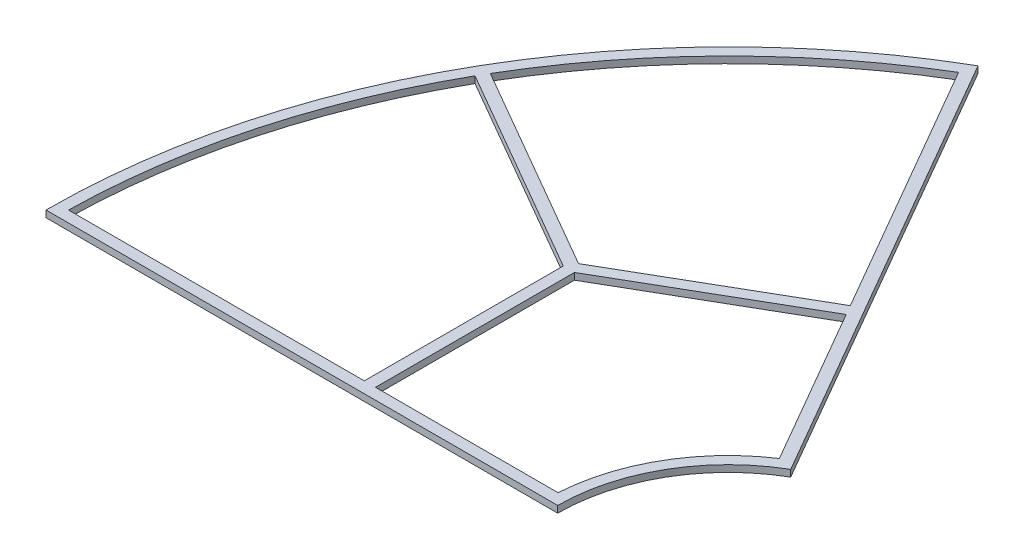
ISO-10303-21;
HEADER;
FILE_DESCRIPTION(('STEP AP214'),'2;1');
FILE_NAME('part.step','',(''),(''),'','','');
FILE_SCHEMA(('AUTOMOTIVE_DESIGN { 1 0 10303 214 1 1 1 1 }'));
ENDSEC;
DATA;
#1=APPLICATION_CONTEXT('core data for automotive mechanical design processes');
#2=APPLICATION_PROTOCOL_DEFINITION('international standard','automotive_design',2000,#1);
#3=PRODUCT_CONTEXT('',#1,'mechanical');
#4=PRODUCT('Part','Part','',(#3));
#5=PRODUCT_RELATED_PRODUCT_CATEGORY('part','',(#4));
#6=PRODUCT_DEFINITION_FORMATION('','',#4);
#7=PRODUCT_DEFINITION_CONTEXT('part definition',#1,'design');
#8=PRODUCT_DEFINITION('design','',#6,#7);
#9=PRODUCT_DEFINITION_SHAPE('','',#8);
#10=(LENGTH_UNIT() NAMED_UNIT(*) SI_UNIT(.MILLI.,.METRE.));
#11=(NAMED_UNIT(*) PLANE_ANGLE_UNIT() SI_UNIT($,.RADIAN.));
#12=(NAMED_UNIT(*) SI_UNIT($,.STERADIAN.) SOLID_ANGLE_UNIT());
#13=UNCERTAINTY_MEASURE_WITH_UNIT(LENGTH_MEASURE(1.E-05),#10,'distance_accuracy_value','');
#14=(GEOMETRIC_REPRESENTATION_CONTEXT(3) GLOBAL_UNCERTAINTY_ASSIGNED_CONTEXT((#13)) GLOBAL_UNIT_ASSIGNED_CONTEXT((#10,
#11,#12)) REPRESENTATION_CONTEXT('',''));
#15=CARTESIAN_POINT('',(0.,0.,0.));
#16=DIRECTION('',(0.,0.,1.));
#17=DIRECTION('',(1.,0.,0.));
#18=AXIS2_PLACEMENT_3D('',#15,#16,#17);
#19=CARTESIAN_POINT('',(2.49999999999996,6.,-4.33012701892212));
#20=DIRECTION('',(-0.5,0.,0.866025403784438));
#21=DIRECTION('',(0.866025403784439,0.,0.5));
#22=AXIS2_PLACEMENT_3D('',#19,#20,#21);
#23=PLANE('',#22);
#24=DIRECTION('',(-0.866025403784439,0.,-0.5));
#25=VECTOR('',#24,1.);
#26=CARTESIAN_POINT('',(2.49999999999996,0.,-4.33012701892212));
#27=LINE('',#26,#25);
#28=CARTESIAN_POINT('',(-330.200000000001,0.,-196.414561578311));
#29=VERTEX_POINT('',#28);
#30=CARTESIAN_POINT('',(-516.750777563212,0.,-304.119703221965));
#31=VERTEX_POINT('',#30);
#32=EDGE_CURVE('E233',#29,#31,#27,.T.);
#33=ORIENTED_EDGE('',*,*,#32,.T.);
#34=DIRECTION('',(0.,-1.,0.));
#35=VECTOR('',#34,1.);
#36=CARTESIAN_POINT('',(-516.750777563212,6.,-304.119703221965));
#37=LINE('',#36,#35);
#38=CARTESIAN_POINT('',(-516.750777563212,6.,-304.119703221965));
#39=VERTEX_POINT('',#38);
#40=EDGE_CURVE('E11',#39,#31,#37,.T.);
#41=ORIENTED_EDGE('',*,*,#40,.F.);
#42=DIRECTION('',(-0.866025403784439,0.,-0.5));
#43=VECTOR('',#42,1.);
#44=CARTESIAN_POINT('',(2.49999999999996,6.,-4.33012701892212));
#45=LINE('',#44,#43);
#46=CARTESIAN_POINT('',(-330.200000000001,6.,-196.414561578311));
#47=VERTEX_POINT('',#46);
#48=EDGE_CURVE('E177',#47,#39,#45,.T.);
#49=ORIENTED_EDGE('',*,*,#48,.F.);
#50=DIRECTION('',(0.,-1.,0.));
#51=VECTOR('',#50,1.);
#52=CARTESIAN_POINT('',(-330.200000000001,6.,-196.414561578311));
#53=LINE('',#52,#51);
#54=EDGE_CURVE('E63',#47,#29,#53,.T.);
#55=ORIENTED_EDGE('',*,*,#54,.T.);
#56=EDGE_LOOP('',(#33,#41,#49,#55));
#57=FACE_BOUND('',#56,.T.);
#58=ADVANCED_FACE('F44',(#57),#23,.F.);
#59=CARTESIAN_POINT('',(1.11022302462516E-13,6.,0.));
#60=DIRECTION('',(0.,-1.,0.));
#61=DIRECTION('',(0.,0.,-1.));
#62=AXIS2_PLACEMENT_3D('',#59,#60,#61);
#63=CYLINDRICAL_SURFACE('',#62,599.6);
#64=CARTESIAN_POINT('',(1.11022302462516E-13,0.,0.));
#65=DIRECTION('',(0.,1.,0.));
#66=DIRECTION('',(0.,0.,1.));
#67=AXIS2_PLACEMENT_3D('',#64,#65,#66);
#68=CIRCLE('',#67,599.6);
#69=CARTESIAN_POINT('',(-308.418556675151,0.,-514.196610158426));
#70=VERTEX_POINT('',#69);
#71=EDGE_CURVE('E183',#31,#70,#68,.F.);
#72=ORIENTED_EDGE('',*,*,#71,.T.);
#73=DIRECTION('',(0.,-1.,0.));
#74=VECTOR('',#73,1.);
#75=CARTESIAN_POINT('',(-308.418556675151,6.,-514.196610158426));
#76=LINE('',#75,#74);
#77=CARTESIAN_POINT('',(-308.418556675151,6.,-514.196610158426));
#78=VERTEX_POINT('',#77);
#79=EDGE_CURVE('E54',#78,#70,#76,.T.);
#80=ORIENTED_EDGE('',*,*,#79,.F.);
#81=CARTESIAN_POINT('',(1.11022302462516E-13,6.,0.));
#82=DIRECTION('',(0.,1.,0.));
#83=DIRECTION('',(0.,0.,1.));
#84=AXIS2_PLACEMENT_3D('',#81,#82,#83);
#85=CIRCLE('',#84,599.6);
#86=EDGE_CURVE('E171',#39,#78,#85,.F.);
#87=ORIENTED_EDGE('',*,*,#86,.F.);
#88=ORIENTED_EDGE('',*,*,#40,.T.);
#89=EDGE_LOOP('',(#72,#80,#87,#88));
#90=FACE_BOUND('',#89,.T.);
#91=ADVANCED_FACE('F182',(#90),#63,.F.);
#92=CARTESIAN_POINT('',(-8.6602540378462,6.,5.00000000000098));
#93=DIRECTION('',(-0.866025403784442,0.,0.499999999999995));
#94=DIRECTION('',(0.499999999999995,0.,0.866025403784442));
#95=AXIS2_PLACEMENT_3D('',#92,#93,#94);
#96=PLANE('',#95);
#97=DIRECTION('',(-0.499999999999995,0.,-0.866025403784442));
#98=VECTOR('',#97,1.);
#99=CARTESIAN_POINT('',(-8.6602540378462,0.,5.00000000000098));
#100=LINE('',#99,#98);
#101=CARTESIAN_POINT('',(-176.260254037845,0.,-285.291715348544));
#102=VERTEX_POINT('',#101);
#103=EDGE_CURVE('E236',#102,#70,#100,.T.);
#104=ORIENTED_EDGE('',*,*,#103,.F.);
#105=DIRECTION('',(0.,-1.,0.));
#106=VECTOR('',#105,1.);
#107=CARTESIAN_POINT('',(-176.260254037845,6.,-285.291715348544));
#108=LINE('',#107,#106);
#109=CARTESIAN_POINT('',(-176.260254037845,6.,-285.291715348544));
#110=VERTEX_POINT('',#109);
#111=EDGE_CURVE('E116',#110,#102,#108,.T.);
#112=ORIENTED_EDGE('',*,*,#111,.F.);
#113=DIRECTION('',(-0.499999999999995,0.,-0.866025403784442));
#114=VECTOR('',#113,1.);
#115=CARTESIAN_POINT('',(-8.6602540378462,6.,5.00000000000098));
#116=LINE('',#115,#114);
#117=EDGE_CURVE('E176',#110,#78,#116,.T.);
#118=ORIENTED_EDGE('',*,*,#117,.T.);
#119=ORIENTED_EDGE('',*,*,#79,.T.);
#120=EDGE_LOOP('',(#104,#112,#118,#119));
#121=FACE_BOUND('',#120,.T.);
#122=ADVANCED_FACE('F187',(#121),#96,.T.);
#123=CARTESIAN_POINT('',(-8.66025403784625,6.,5.000000000001));
#124=DIRECTION('',(-0.866025403784442,0.,0.499999999999994));
#125=DIRECTION('',(0.499999999999994,0.,0.866025403784442));
#126=AXIS2_PLACEMENT_3D('',#123,#124,#125);
#127=PLANE('',#126);
#128=DIRECTION('',(-0.499999999999994,0.,-0.866025403784442));
#129=VECTOR('',#128,1.);
#130=CARTESIAN_POINT('',(-8.66025403784625,0.,5.000000000001));
#131=LINE('',#130,#129);
#132=CARTESIAN_POINT('',(-89.7061669514525,0.,-135.37563891217));
#133=VERTEX_POINT('',#132);
#134=CARTESIAN_POINT('',(-171.260254037845,0.,-276.6314613107));
#135=VERTEX_POINT('',#134);
#136=EDGE_CURVE('E218',#133,#135,#131,.T.);
#137=ORIENTED_EDGE('',*,*,#136,.F.);
#138=DIRECTION('',(0.,-1.,0.));
#139=VECTOR('',#138,1.);
#140=CARTESIAN_POINT('',(-89.7061669514525,6.,-135.37563891217));
#141=LINE('',#140,#139);
#142=CARTESIAN_POINT('',(-89.7061669514525,6.,-135.37563891217));
#143=VERTEX_POINT('',#142);
#144=EDGE_CURVE('E243',#143,#133,#141,.T.);
#145=ORIENTED_EDGE('',*,*,#144,.F.);
#146=DIRECTION('',(-0.499999999999994,0.,-0.866025403784442));
#147=VECTOR('',#146,1.);
#148=CARTESIAN_POINT('',(-8.66025403784625,6.,5.000000000001));
#149=LINE('',#148,#147);
#150=CARTESIAN_POINT('',(-171.260254037845,6.,-276.6314613107));
#151=VERTEX_POINT('',#150);
#152=EDGE_CURVE('E548',#143,#151,#149,.T.);
#153=ORIENTED_EDGE('',*,*,#152,.T.);
#154=DIRECTION('',(0.,-1.,0.));
#155=VECTOR('',#154,1.);
#156=CARTESIAN_POINT('',(-171.260254037845,6.,-276.6314613107));
#157=LINE('',#156,#155);
#158=EDGE_CURVE('E245',#151,#135,#157,.T.);
#159=ORIENTED_EDGE('',*,*,#158,.T.);
#160=EDGE_LOOP('',(#137,#145,#153,#159));
#161=FACE_BOUND('',#160,.T.);
#162=ADVANCED_FACE('F320',(#161),#127,.T.);
#163=CARTESIAN_POINT('',(0.,6.,0.));
#164=DIRECTION('',(0.,-1.,0.));
#165=DIRECTION('',(0.,0.,-1.));
#166=AXIS2_PLACEMENT_3D('',#163,#164,#165);
#167=CYLINDRICAL_SURFACE('',#166,162.4);
#168=CARTESIAN_POINT('',(0.,0.,0.));
#169=DIRECTION('',(0.,1.,0.));
#170=DIRECTION('',(0.,0.,1.));
#171=AXIS2_PLACEMENT_3D('',#168,#169,#170);
#172=CIRCLE('',#171,162.4);
#173=CARTESIAN_POINT('',(-162.091825827214,0.,-10.));
#174=VERTEX_POINT('',#173);
#175=EDGE_CURVE('E221',#133,#174,#172,.T.);
#176=ORIENTED_EDGE('',*,*,#175,.T.);
#177=DIRECTION('',(0.,-1.,0.));
#178=VECTOR('',#177,1.);
#179=CARTESIAN_POINT('',(-162.091825827214,6.,-10.));
#180=LINE('',#179,#178);
#181=CARTESIAN_POINT('',(-162.091825827214,6.,-10.));
#182=VERTEX_POINT('',#181);
#183=EDGE_CURVE('E254',#182,#174,#180,.T.);
#184=ORIENTED_EDGE('',*,*,#183,.F.);
#185=CARTESIAN_POINT('',(0.,6.,0.));
#186=DIRECTION('',(0.,1.,0.));
#187=DIRECTION('',(0.,0.,1.));
#188=AXIS2_PLACEMENT_3D('',#185,#186,#187);
#189=CIRCLE('',#188,162.4);
#190=EDGE_CURVE('E545',#143,#182,#189,.T.);
#191=ORIENTED_EDGE('',*,*,#190,.F.);
#192=ORIENTED_EDGE('',*,*,#144,.T.);
#193=EDGE_LOOP('',(#176,#184,#191,#192));
#194=FACE_BOUND('',#193,.T.);
#195=ADVANCED_FACE('F316',(#194),#167,.T.);
#196=CARTESIAN_POINT('',(0.,6.,-10.));
#197=DIRECTION('',(0.,0.,1.));
#198=DIRECTION('',(1.,0.,0.));
#199=AXIS2_PLACEMENT_3D('',#196,#197,#198);
#200=PLANE('',#199);
#201=DIRECTION('',(-1.,0.,0.));
#202=VECTOR('',#201,1.);
#203=CARTESIAN_POINT('',(0.,0.,-10.));
#204=LINE('',#203,#202);
#205=CARTESIAN_POINT('',(-325.2,0.,-10.));
#206=VERTEX_POINT('',#205);
#207=EDGE_CURVE('E224',#174,#206,#204,.T.);
#208=ORIENTED_EDGE('',*,*,#207,.T.);
#209=DIRECTION('',(0.,-1.,0.));
#210=VECTOR('',#209,1.);
#211=CARTESIAN_POINT('',(-325.2,6.,-10.));
#212=LINE('',#211,#210);
#213=CARTESIAN_POINT('',(-325.2,6.,-10.));
#214=VERTEX_POINT('',#213);
#215=EDGE_CURVE('E251',#214,#206,#212,.T.);
#216=ORIENTED_EDGE('',*,*,#215,.F.);
#217=DIRECTION('',(-1.,0.,0.));
#218=VECTOR('',#217,1.);
#219=CARTESIAN_POINT('',(0.,6.,-10.));
#220=LINE('',#219,#218);
#221=EDGE_CURVE('E542',#182,#214,#220,.T.);
#222=ORIENTED_EDGE('',*,*,#221,.F.);
#223=ORIENTED_EDGE('',*,*,#183,.T.);
#224=EDGE_LOOP('',(#208,#216,#222,#223));
#225=FACE_BOUND('',#224,.T.);
#226=ADVANCED_FACE('F312',(#225),#200,.F.);
#227=CARTESIAN_POINT('',(-325.2,6.,0.));
#228=DIRECTION('',(-1.,0.,0.));
#229=DIRECTION('',(0.,0.,1.));
#230=AXIS2_PLACEMENT_3D('',#227,#228,#229);
#231=PLANE('',#230);
#232=DIRECTION('',(0.,0.,-1.));
#233=VECTOR('',#232,1.);
#234=CARTESIAN_POINT('',(-325.2,0.,0.));
#235=LINE('',#234,#233);
#236=CARTESIAN_POINT('',(-325.2,0.,-187.754307540467));
#237=VERTEX_POINT('',#236);
#238=EDGE_CURVE('E227',#206,#237,#235,.T.);
#239=ORIENTED_EDGE('',*,*,#238,.T.);
#240=DIRECTION('',(0.,-1.,0.));
#241=VECTOR('',#240,1.);
#242=CARTESIAN_POINT('',(-325.2,6.,-187.754307540467));
#243=LINE('',#242,#241);
#244=CARTESIAN_POINT('',(-325.2,6.,-187.754307540467));
#245=VERTEX_POINT('',#244);
#246=EDGE_CURVE('E247',#245,#237,#243,.T.);
#247=ORIENTED_EDGE('',*,*,#246,.F.);
#248=DIRECTION('',(0.,0.,-1.));
#249=VECTOR('',#248,1.);
#250=CARTESIAN_POINT('',(-325.2,6.,0.));
#251=LINE('',#250,#249);
#252=EDGE_CURVE('E537',#214,#245,#251,.T.);
#253=ORIENTED_EDGE('',*,*,#252,.F.);
#254=ORIENTED_EDGE('',*,*,#215,.T.);
#255=EDGE_LOOP('',(#239,#247,#253,#254));
#256=FACE_BOUND('',#255,.T.);
#257=ADVANCED_FACE('F308',(#256),#231,.F.);
#258=CARTESIAN_POINT('',(0.,6.,-10.));
#259=DIRECTION('',(0.,0.,1.));
#260=DIRECTION('',(1.,0.,0.));
#261=AXIS2_PLACEMENT_3D('',#258,#259,#260);
#262=PLANE('',#261);
#263=DIRECTION('',(-1.,0.,0.));
#264=VECTOR('',#263,1.);
#265=CARTESIAN_POINT('',(0.,0.,-10.));
#266=LINE('',#265,#264);
#267=CARTESIAN_POINT('',(-335.2,0.,-10.));
#268=VERTEX_POINT('',#267);
#269=CARTESIAN_POINT('',(-599.516605274616,0.,-10.));
#270=VERTEX_POINT('',#269);
#271=EDGE_CURVE('E206',#268,#270,#266,.T.);
#272=ORIENTED_EDGE('',*,*,#271,.T.);
#273=DIRECTION('',(0.,-1.,0.));
#274=VECTOR('',#273,1.);
#275=CARTESIAN_POINT('',(-599.516605274616,6.,-10.));
#276=LINE('',#275,#274);
#277=CARTESIAN_POINT('',(-599.516605274616,6.,-10.));
#278=VERTEX_POINT('',#277);
#279=EDGE_CURVE('E248',#278,#270,#276,.T.);
#280=ORIENTED_EDGE('',*,*,#279,.F.);
#281=DIRECTION('',(-1.,0.,0.));
#282=VECTOR('',#281,1.);
#283=CARTESIAN_POINT('',(0.,6.,-10.));
#284=LINE('',#283,#282);
#285=CARTESIAN_POINT('',(-335.2,6.,-10.));
#286=VERTEX_POINT('',#285);
#287=EDGE_CURVE('E559',#286,#278,#284,.T.);
#288=ORIENTED_EDGE('',*,*,#287,.F.);
#289=DIRECTION('',(0.,-1.,0.));
#290=VECTOR('',#289,1.);
#291=CARTESIAN_POINT('',(-335.2,6.,-10.));
#292=LINE('',#291,#290);
#293=EDGE_CURVE('E258',#286,#268,#292,.T.);
#294=ORIENTED_EDGE('',*,*,#293,.T.);
#295=EDGE_LOOP('',(#272,#280,#288,#294));
#296=FACE_BOUND('',#295,.T.);
#297=ADVANCED_FACE('F311',(#296),#262,.F.);
#298=CARTESIAN_POINT('',(1.11022302462516E-13,6.,0.));
#299=DIRECTION('',(0.,-1.,0.));
#300=DIRECTION('',(0.,0.,-1.));
#301=AXIS2_PLACEMENT_3D('',#298,#299,#300);
#302=CYLINDRICAL_SURFACE('',#301,599.6);
#303=CARTESIAN_POINT('',(1.11022302462516E-13,0.,0.));
#304=DIRECTION('',(0.,1.,0.));
#305=DIRECTION('',(0.,0.,1.));
#306=AXIS2_PLACEMENT_3D('',#303,#304,#305);
#307=CIRCLE('',#306,599.6);
#308=CARTESIAN_POINT('',(-521.750777563212,0.,-295.459449184121));
#309=VERTEX_POINT('',#308);
#310=EDGE_CURVE('E209',#270,#309,#307,.F.);
#311=ORIENTED_EDGE('',*,*,#310,.T.);
#312=DIRECTION('',(0.,-1.,0.));
#313=VECTOR('',#312,1.);
#314=CARTESIAN_POINT('',(-521.750777563212,6.,-295.459449184121));
#315=LINE('',#314,#313);
#316=CARTESIAN_POINT('',(-521.750777563212,6.,-295.459449184121));
#317=VERTEX_POINT('',#316);
#318=EDGE_CURVE('E262',#317,#309,#315,.T.);
#319=ORIENTED_EDGE('',*,*,#318,.F.);
#320=CARTESIAN_POINT('',(1.11022302462516E-13,6.,0.));
#321=DIRECTION('',(0.,1.,0.));
#322=DIRECTION('',(0.,0.,1.));
#323=AXIS2_PLACEMENT_3D('',#320,#321,#322);
#324=CIRCLE('',#323,599.6);
#325=EDGE_CURVE('E557',#278,#317,#324,.F.);
#326=ORIENTED_EDGE('',*,*,#325,.F.);
#327=ORIENTED_EDGE('',*,*,#279,.T.);
#328=EDGE_LOOP('',(#311,#319,#326,#327));
#329=FACE_BOUND('',#328,.T.);
#330=ADVANCED_FACE('F331',(#329),#302,.F.);
#331=CARTESIAN_POINT('',(-2.49999999999999,6.,4.33012701892217));
#332=DIRECTION('',(-0.5,0.,0.866025403784439));
#333=DIRECTION('',(0.866025403784439,0.,0.5));
#334=AXIS2_PLACEMENT_3D('',#331,#332,#333);
#335=PLANE('',#334);
#336=DIRECTION('',(-0.866025403784439,0.,-0.5));
#337=VECTOR('',#336,1.);
#338=CARTESIAN_POINT('',(-2.49999999999999,0.,4.33012701892217));
#339=LINE('',#338,#337);
#340=CARTESIAN_POINT('',(-335.2,0.,-187.754307540466));
#341=VERTEX_POINT('',#340);
#342=EDGE_CURVE('E212',#341,#309,#339,.T.);
#343=ORIENTED_EDGE('',*,*,#342,.F.);
#344=DIRECTION('',(0.,-1.,0.));
#345=VECTOR('',#344,1.);
#346=CARTESIAN_POINT('',(-335.2,6.,-187.754307540466));
#347=LINE('',#346,#345);
#348=CARTESIAN_POINT('',(-335.2,6.,-187.754307540466));
#349=VERTEX_POINT('',#348);
#350=EDGE_CURVE('E260',#349,#341,#347,.T.);
#351=ORIENTED_EDGE('',*,*,#350,.F.);
#352=DIRECTION('',(-0.866025403784439,0.,-0.5));
#353=VECTOR('',#352,1.);
#354=CARTESIAN_POINT('',(-2.49999999999999,6.,4.33012701892217));
#355=LINE('',#354,#353);
#356=EDGE_CURVE('E554',#349,#317,#355,.T.);
#357=ORIENTED_EDGE('',*,*,#356,.T.);
#358=ORIENTED_EDGE('',*,*,#318,.T.);
#359=EDGE_LOOP('',(#343,#351,#357,#358));
#360=FACE_BOUND('',#359,.T.);
#361=ADVANCED_FACE('F328',(#360),#335,.T.);
#362=CARTESIAN_POINT('',(0.,6.,0.));
#363=DIRECTION('',(0.,-1.,0.));
#364=DIRECTION('',(0.,0.,-1.));
#365=AXIS2_PLACEMENT_3D('',#362,#363,#364);
#366=CYLINDRICAL_SURFACE('',#365,152.4);
#367=CARTESIAN_POINT('',(0.,0.,0.));
#368=DIRECTION('',(0.,1.,0.));
#369=DIRECTION('',(0.,0.,1.));
#370=AXIS2_PLACEMENT_3D('',#367,#368,#369);
#371=CIRCLE('',#370,152.4);
#372=CARTESIAN_POINT('',(-76.200000000001,0.,-131.982271536748));
#373=VERTEX_POINT('',#372);
#374=CARTESIAN_POINT('',(-152.4,0.,0.));
#375=VERTEX_POINT('',#374);
#376=EDGE_CURVE('E194',#373,#375,#371,.T.);
#377=ORIENTED_EDGE('',*,*,#376,.F.);
#378=DIRECTION('',(0.,-1.,0.));
#379=VECTOR('',#378,1.);
#380=CARTESIAN_POINT('',(-76.200000000001,6.,-131.982271536748));
#381=LINE('',#380,#379);
#382=CARTESIAN_POINT('',(-76.200000000001,6.,-131.982271536748));
#383=VERTEX_POINT('',#382);
#384=EDGE_CURVE('E48',#383,#373,#381,.T.);
#385=ORIENTED_EDGE('',*,*,#384,.F.);
#386=CARTESIAN_POINT('',(0.,6.,0.));
#387=DIRECTION('',(0.,1.,0.));
#388=DIRECTION('',(0.,0.,1.));
#389=AXIS2_PLACEMENT_3D('',#386,#387,#388);
#390=CIRCLE('',#389,152.4);
#391=CARTESIAN_POINT('',(-152.4,6.,0.));
#392=VERTEX_POINT('',#391);
#393=EDGE_CURVE('E241',#383,#392,#390,.T.);
#394=ORIENTED_EDGE('',*,*,#393,.T.);
#395=DIRECTION('',(0.,-1.,0.));
#396=VECTOR('',#395,1.);
#397=CARTESIAN_POINT('',(-152.4,6.,0.));
#398=LINE('',#397,#396);
#399=EDGE_CURVE('E190',#392,#375,#398,.T.);
#400=ORIENTED_EDGE('',*,*,#399,.T.);
#401=EDGE_LOOP('',(#377,#385,#394,#400));
#402=FACE_BOUND('',#401,.T.);
#403=ADVANCED_FACE('F46',(#402),#366,.F.);
#404=CARTESIAN_POINT('',(-1.69461086737552E-12,6.,9.7838404045091E-13));
#405=DIRECTION('',(-0.866025403784441,0.,0.499999999999995));
#406=DIRECTION('',(0.499999999999995,0.,0.866025403784441));
#407=AXIS2_PLACEMENT_3D('',#404,#405,#406);
#408=PLANE('',#407);
#409=DIRECTION('',(-0.499999999999995,0.,-0.866025403784441));
#410=VECTOR('',#409,1.);
#411=CARTESIAN_POINT('',(-1.69461086737552E-12,0.,9.7838404045091E-13));
#412=LINE('',#411,#410);
#413=CARTESIAN_POINT('',(-304.799999999999,0.,-527.929086146995));
#414=VERTEX_POINT('',#413);
#415=EDGE_CURVE('E197',#373,#414,#412,.T.);
#416=ORIENTED_EDGE('',*,*,#415,.T.);
#417=DIRECTION('',(0.,-1.,0.));
#418=VECTOR('',#417,1.);
#419=CARTESIAN_POINT('',(-304.799999999999,6.,-527.929086146995));
#420=LINE('',#419,#418);
#421=CARTESIAN_POINT('',(-304.799999999999,6.,-527.929086146995));
#422=VERTEX_POINT('',#421);
#423=EDGE_CURVE('E268',#422,#414,#420,.T.);
#424=ORIENTED_EDGE('',*,*,#423,.F.);
#425=DIRECTION('',(-0.499999999999995,0.,-0.866025403784441));
#426=VECTOR('',#425,1.);
#427=CARTESIAN_POINT('',(-1.69461086737552E-12,6.,9.7838404045091E-13));
#428=LINE('',#427,#426);
#429=EDGE_CURVE('E276',#383,#422,#428,.T.);
#430=ORIENTED_EDGE('',*,*,#429,.F.);
#431=ORIENTED_EDGE('',*,*,#384,.T.);
#432=EDGE_LOOP('',(#416,#424,#430,#431));
#433=FACE_BOUND('',#432,.T.);
#434=ADVANCED_FACE('F275',(#433),#408,.F.);
#435=CARTESIAN_POINT('',(1.11022302462516E-13,6.,0.));
#436=DIRECTION('',(0.,-1.,0.));
#437=DIRECTION('',(0.,0.,-1.));
#438=AXIS2_PLACEMENT_3D('',#435,#436,#437);
#439=CYLINDRICAL_SURFACE('',#438,609.6);
#440=CARTESIAN_POINT('',(1.11022302462516E-13,0.,0.));
#441=DIRECTION('',(0.,1.,0.));
#442=DIRECTION('',(0.,0.,1.));
#443=AXIS2_PLACEMENT_3D('',#440,#441,#442);
#444=CIRCLE('',#443,609.6);
#445=CARTESIAN_POINT('',(-609.6,0.,0.));
#446=VERTEX_POINT('',#445);
#447=EDGE_CURVE('E200',#446,#414,#444,.F.);
#448=ORIENTED_EDGE('',*,*,#447,.F.);
#449=DIRECTION('',(0.,-1.,0.));
#450=VECTOR('',#449,1.);
#451=CARTESIAN_POINT('',(-609.6,6.,0.));
#452=LINE('',#451,#450);
#453=CARTESIAN_POINT('',(-609.6,6.,0.));
#454=VERTEX_POINT('',#453);
#455=EDGE_CURVE('E267',#454,#446,#452,.T.);
#456=ORIENTED_EDGE('',*,*,#455,.F.);
#457=CARTESIAN_POINT('',(1.11022302462516E-13,6.,0.));
#458=DIRECTION('',(0.,1.,0.));
#459=DIRECTION('',(0.,0.,1.));
#460=AXIS2_PLACEMENT_3D('',#457,#458,#459);
#461=CIRCLE('',#460,609.6);
#462=EDGE_CURVE('E563',#454,#422,#461,.F.);
#463=ORIENTED_EDGE('',*,*,#462,.T.);
#464=ORIENTED_EDGE('',*,*,#423,.T.);
#465=EDGE_LOOP('',(#448,#456,#463,#464));
#466=FACE_BOUND('',#465,.T.);
#467=ADVANCED_FACE('F288',(#466),#439,.T.);
#468=CARTESIAN_POINT('',(-162.6,6.,-281.6314613107));
#469=DIRECTION('',(-0.5,0.,-0.866025403784438));
#470=DIRECTION('',(-0.866025403784439,0.,0.5));
#471=AXIS2_PLACEMENT_3D('',#468,#469,#470);
#472=PLANE('',#471);
#473=DIRECTION('',(0.866025403784439,0.,-0.5));
#474=VECTOR('',#473,1.);
#475=CARTESIAN_POINT('',(-162.6,0.,-281.6314613107));
#476=LINE('',#475,#474);
#477=EDGE_CURVE('E230',#237,#135,#476,.T.);
#478=ORIENTED_EDGE('',*,*,#477,.T.);
#479=ORIENTED_EDGE('',*,*,#158,.F.);
#480=DIRECTION('',(0.866025403784439,0.,-0.5));
#481=VECTOR('',#480,1.);
#482=CARTESIAN_POINT('',(-162.6,6.,-281.6314613107));
#483=LINE('',#482,#481);
#484=EDGE_CURVE('E536',#245,#151,#483,.T.);
#485=ORIENTED_EDGE('',*,*,#484,.F.);
#486=ORIENTED_EDGE('',*,*,#246,.T.);
#487=EDGE_LOOP('',(#478,#479,#485,#486));
#488=FACE_BOUND('',#487,.T.);
#489=ADVANCED_FACE('F290',(#488),#472,.F.);
#490=CARTESIAN_POINT('',(-335.2,6.,0.));
#491=DIRECTION('',(-1.,0.,0.));
#492=DIRECTION('',(0.,0.,1.));
#493=AXIS2_PLACEMENT_3D('',#490,#491,#492);
#494=PLANE('',#493);
#495=DIRECTION('',(0.,0.,-1.));
#496=VECTOR('',#495,1.);
#497=CARTESIAN_POINT('',(-335.2,0.,0.));
#498=LINE('',#497,#496);
#499=EDGE_CURVE('E215',#268,#341,#498,.T.);
#500=ORIENTED_EDGE('',*,*,#499,.F.);
#501=ORIENTED_EDGE('',*,*,#293,.F.);
#502=DIRECTION('',(0.,0.,-1.));
#503=VECTOR('',#502,1.);
#504=CARTESIAN_POINT('',(-335.2,6.,0.));
#505=LINE('',#504,#503);
#506=EDGE_CURVE('E551',#286,#349,#505,.T.);
#507=ORIENTED_EDGE('',*,*,#506,.T.);
#508=ORIENTED_EDGE('',*,*,#350,.T.);
#509=EDGE_LOOP('',(#500,#501,#507,#508));
#510=FACE_BOUND('',#509,.T.);
#511=ADVANCED_FACE('F296',(#510),#494,.T.);
#512=CARTESIAN_POINT('',(0.,6.,0.));
#513=DIRECTION('',(0.,0.,1.));
#514=DIRECTION('',(1.,0.,0.));
#515=AXIS2_PLACEMENT_3D('',#512,#513,#514);
#516=PLANE('',#515);
#517=DIRECTION('',(-1.,0.,0.));
#518=VECTOR('',#517,1.);
#519=CARTESIAN_POINT('',(0.,0.,0.));
#520=LINE('',#519,#518);
#521=EDGE_CURVE('E203',#375,#446,#520,.T.);
#522=ORIENTED_EDGE('',*,*,#521,.F.);
#523=ORIENTED_EDGE('',*,*,#399,.F.);
#524=DIRECTION('',(-1.,0.,0.));
#525=VECTOR('',#524,1.);
#526=CARTESIAN_POINT('',(0.,6.,0.));
#527=LINE('',#526,#525);
#528=EDGE_CURVE('E286',#392,#454,#527,.T.);
#529=ORIENTED_EDGE('',*,*,#528,.T.);
#530=ORIENTED_EDGE('',*,*,#455,.T.);
#531=EDGE_LOOP('',(#522,#523,#529,#530));
#532=FACE_BOUND('',#531,.T.);
#533=ADVANCED_FACE('F285',(#532),#516,.T.);
#534=CARTESIAN_POINT('',(-167.6,6.,-290.291715348544));
#535=DIRECTION('',(-0.5,0.,-0.866025403784438));
#536=DIRECTION('',(-0.866025403784439,0.,0.5));
#537=AXIS2_PLACEMENT_3D('',#534,#535,#536);
#538=PLANE('',#537);
#539=DIRECTION('',(0.866025403784438,0.,-0.5));
#540=VECTOR('',#539,1.);
#541=CARTESIAN_POINT('',(-167.6,0.,-290.291715348544));
#542=LINE('',#541,#540);
#543=EDGE_CURVE('E238',#29,#102,#542,.T.);
#544=ORIENTED_EDGE('',*,*,#543,.F.);
#545=ORIENTED_EDGE('',*,*,#54,.F.);
#546=DIRECTION('',(0.866025403784438,0.,-0.5));
#547=VECTOR('',#546,1.);
#548=CARTESIAN_POINT('',(-167.6,6.,-290.291715348544));
#549=LINE('',#548,#547);
#550=EDGE_CURVE('E188',#47,#110,#549,.T.);
#551=ORIENTED_EDGE('',*,*,#550,.T.);
#552=ORIENTED_EDGE('',*,*,#111,.T.);
#553=EDGE_LOOP('',(#544,#545,#551,#552));
#554=FACE_BOUND('',#553,.T.);
#555=ADVANCED_FACE('F339',(#554),#538,.T.);
#556=CARTESIAN_POINT('',(0.,6.,0.));
#557=DIRECTION('',(0.,1.,0.));
#558=DIRECTION('',(0.,0.,1.));
#559=AXIS2_PLACEMENT_3D('',#556,#557,#558);
#560=PLANE('',#559);
#561=ORIENTED_EDGE('',*,*,#393,.F.);
#562=ORIENTED_EDGE('',*,*,#429,.T.);
#563=ORIENTED_EDGE('',*,*,#462,.F.);
#564=ORIENTED_EDGE('',*,*,#528,.F.);
#565=EDGE_LOOP('',(#561,#562,#563,#564));
#566=FACE_BOUND('',#565,.T.);
#567=ORIENTED_EDGE('',*,*,#287,.T.);
#568=ORIENTED_EDGE('',*,*,#325,.T.);
#569=ORIENTED_EDGE('',*,*,#356,.F.);
#570=ORIENTED_EDGE('',*,*,#506,.F.);
#571=EDGE_LOOP('',(#567,#568,#569,#570));
#572=FACE_BOUND('',#571,.T.);
#573=ORIENTED_EDGE('',*,*,#152,.F.);
#574=ORIENTED_EDGE('',*,*,#190,.T.);
#575=ORIENTED_EDGE('',*,*,#221,.T.);
#576=ORIENTED_EDGE('',*,*,#252,.T.);
#577=ORIENTED_EDGE('',*,*,#484,.T.);
#578=EDGE_LOOP('',(#573,#574,#575,#576,#577));
#579=FACE_BOUND('',#578,.T.);
#580=ORIENTED_EDGE('',*,*,#48,.T.);
#581=ORIENTED_EDGE('',*,*,#86,.T.);
#582=ORIENTED_EDGE('',*,*,#117,.F.);
#583=ORIENTED_EDGE('',*,*,#550,.F.);
#584=EDGE_LOOP('',(#580,#581,#582,#583));
#585=FACE_BOUND('',#584,.T.);
#586=ADVANCED_FACE('F173',(#566,#572,#579,#585),#560,.T.);
#587=CARTESIAN_POINT('',(0.,0.,0.));
#588=DIRECTION('',(0.,1.,0.));
#589=DIRECTION('',(0.,0.,1.));
#590=AXIS2_PLACEMENT_3D('',#587,#588,#589);
#591=PLANE('',#590);
#592=ORIENTED_EDGE('',*,*,#376,.T.);
#593=ORIENTED_EDGE('',*,*,#521,.T.);
#594=ORIENTED_EDGE('',*,*,#447,.T.);
#595=ORIENTED_EDGE('',*,*,#415,.F.);
#596=EDGE_LOOP('',(#592,#593,#594,#595));
#597=FACE_BOUND('',#596,.T.);
#598=ORIENTED_EDGE('',*,*,#271,.F.);
#599=ORIENTED_EDGE('',*,*,#499,.T.);
#600=ORIENTED_EDGE('',*,*,#342,.T.);
#601=ORIENTED_EDGE('',*,*,#310,.F.);
#602=EDGE_LOOP('',(#598,#599,#600,#601));
#603=FACE_BOUND('',#602,.T.);
#604=ORIENTED_EDGE('',*,*,#136,.T.);
#605=ORIENTED_EDGE('',*,*,#477,.F.);
#606=ORIENTED_EDGE('',*,*,#238,.F.);
#607=ORIENTED_EDGE('',*,*,#207,.F.);
#608=ORIENTED_EDGE('',*,*,#175,.F.);
#609=EDGE_LOOP('',(#604,#605,#606,#607,#608));
#610=FACE_BOUND('',#609,.T.);
#611=ORIENTED_EDGE('',*,*,#32,.F.);
#612=ORIENTED_EDGE('',*,*,#543,.T.);
#613=ORIENTED_EDGE('',*,*,#103,.T.);
#614=ORIENTED_EDGE('',*,*,#71,.F.);
#615=EDGE_LOOP('',(#611,#612,#613,#614));
#616=FACE_BOUND('',#615,.T.);
#617=ADVANCED_FACE('F279',(#597,#603,#610,#616),#591,.F.);
#618=CLOSED_SHELL('',(#58,#91,#122,#162,#195,#226,#257,#297,#330,#361,#403,#434,#467,#489,#511,
#533,#555,#586,#617));
#619=MANIFOLD_SOLID_BREP('B2',#618);
#620=ADVANCED_BREP_SHAPE_REPRESENTATION('',(#18,#619),#14);
#621=SHAPE_DEFINITION_REPRESENTATION(#9,#620);
ENDSEC;
END-ISO-10303-21;
